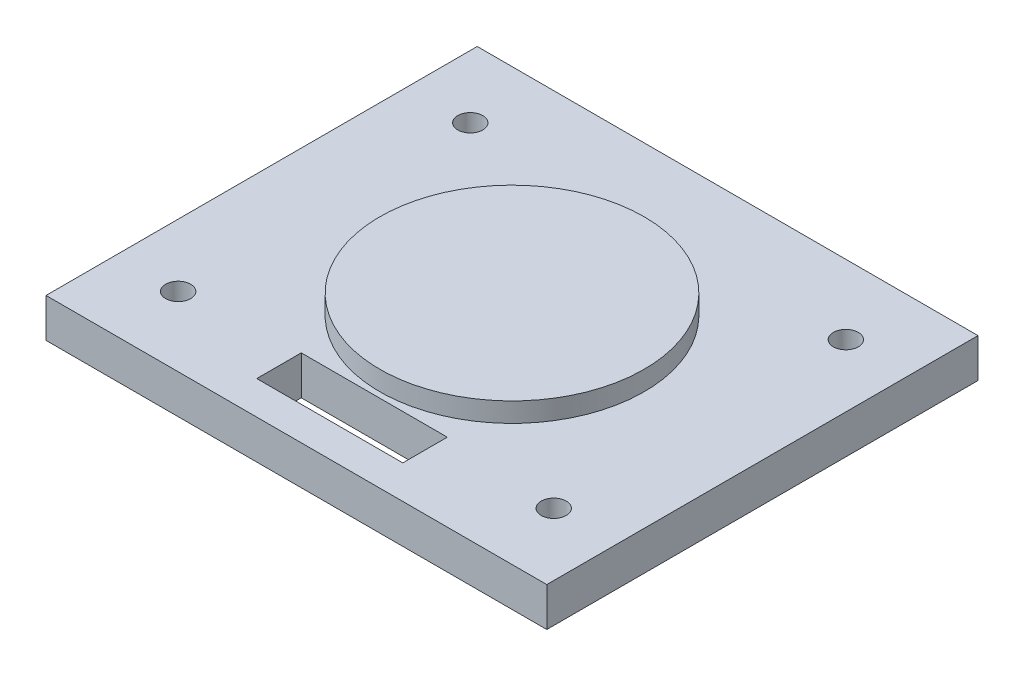
ISO-10303-21;
HEADER;
FILE_DESCRIPTION(('STEP AP214'),'2;1');
FILE_NAME('part.step','',(''),(''),'','','');
FILE_SCHEMA(('AUTOMOTIVE_DESIGN { 1 0 10303 214 1 1 1 1 }'));
ENDSEC;
DATA;
#1=APPLICATION_CONTEXT('core data for automotive mechanical design processes');
#2=APPLICATION_PROTOCOL_DEFINITION('international standard','automotive_design',2000,#1);
#3=PRODUCT_CONTEXT('',#1,'mechanical');
#4=PRODUCT('Part','Part','',(#3));
#5=PRODUCT_RELATED_PRODUCT_CATEGORY('part','',(#4));
#6=PRODUCT_DEFINITION_FORMATION('','',#4);
#7=PRODUCT_DEFINITION_CONTEXT('part definition',#1,'design');
#8=PRODUCT_DEFINITION('design','',#6,#7);
#9=PRODUCT_DEFINITION_SHAPE('','',#8);
#10=(LENGTH_UNIT() NAMED_UNIT(*) SI_UNIT(.MILLI.,.METRE.));
#11=(NAMED_UNIT(*) PLANE_ANGLE_UNIT() SI_UNIT($,.RADIAN.));
#12=(NAMED_UNIT(*) SI_UNIT($,.STERADIAN.) SOLID_ANGLE_UNIT());
#13=UNCERTAINTY_MEASURE_WITH_UNIT(LENGTH_MEASURE(1.E-05),#10,'distance_accuracy_value','');
#14=(GEOMETRIC_REPRESENTATION_CONTEXT(3) GLOBAL_UNCERTAINTY_ASSIGNED_CONTEXT((#13)) GLOBAL_UNIT_ASSIGNED_CONTEXT((#10,
#11,#12)) REPRESENTATION_CONTEXT('',''));
#15=CARTESIAN_POINT('',(0.,0.,0.));
#16=DIRECTION('',(0.,0.,1.));
#17=DIRECTION('',(1.,0.,0.));
#18=AXIS2_PLACEMENT_3D('',#15,#16,#17);
#19=CARTESIAN_POINT('',(0.,28.,0.));
#20=DIRECTION('',(0.,-1.,0.));
#21=DIRECTION('',(0.,0.,-1.));
#22=AXIS2_PLACEMENT_3D('',#19,#20,#21);
#23=PLANE('',#22);
#24=CARTESIAN_POINT('',(0.,28.,0.));
#25=DIRECTION('',(0.,-1.,0.));
#26=DIRECTION('',(0.,0.,-1.));
#27=AXIS2_PLACEMENT_3D('',#24,#25,#26);
#28=CIRCLE('',#27,95.);
#29=CARTESIAN_POINT('',(0.,28.,-95.));
#30=VERTEX_POINT('',#29);
#31=EDGE_CURVE('E11',#30,#30,#28,.F.);
#32=ORIENTED_EDGE('',*,*,#31,.F.);
#33=EDGE_LOOP('',(#32));
#34=FACE_BOUND('',#33,.T.);
#35=CARTESIAN_POINT('',(135.,28.,-105.));
#36=DIRECTION('',(0.,1.,0.));
#37=DIRECTION('',(0.,0.,1.));
#38=AXIS2_PLACEMENT_3D('',#35,#36,#37);
#39=CIRCLE('',#38,9.00000000000001);
#40=CARTESIAN_POINT('',(135.,28.,-96.));
#41=VERTEX_POINT('',#40);
#42=EDGE_CURVE('E142',#41,#41,#39,.T.);
#43=ORIENTED_EDGE('',*,*,#42,.F.);
#44=EDGE_LOOP('',(#43));
#45=FACE_BOUND('',#44,.T.);
#46=CARTESIAN_POINT('',(-135.,28.,-105.));
#47=DIRECTION('',(0.,1.,0.));
#48=DIRECTION('',(0.,0.,1.));
#49=AXIS2_PLACEMENT_3D('',#46,#47,#48);
#50=CIRCLE('',#49,9.00000000000001);
#51=CARTESIAN_POINT('',(-135.,28.,-96.));
#52=VERTEX_POINT('',#51);
#53=EDGE_CURVE('E148',#52,#52,#50,.T.);
#54=ORIENTED_EDGE('',*,*,#53,.F.);
#55=EDGE_LOOP('',(#54));
#56=FACE_BOUND('',#55,.T.);
#57=CARTESIAN_POINT('',(135.,28.,105.));
#58=DIRECTION('',(0.,1.,0.));
#59=DIRECTION('',(0.,0.,1.));
#60=AXIS2_PLACEMENT_3D('',#57,#58,#59);
#61=CIRCLE('',#60,9.00000000000001);
#62=CARTESIAN_POINT('',(135.,28.,114.));
#63=VERTEX_POINT('',#62);
#64=EDGE_CURVE('E154',#63,#63,#61,.T.);
#65=ORIENTED_EDGE('',*,*,#64,.F.);
#66=EDGE_LOOP('',(#65));
#67=FACE_BOUND('',#66,.T.);
#68=CARTESIAN_POINT('',(-135.,28.,105.));
#69=DIRECTION('',(0.,1.,0.));
#70=DIRECTION('',(0.,0.,1.));
#71=AXIS2_PLACEMENT_3D('',#68,#69,#70);
#72=CIRCLE('',#71,9.00000000000001);
#73=CARTESIAN_POINT('',(-135.,28.,114.));
#74=VERTEX_POINT('',#73);
#75=EDGE_CURVE('E160',#74,#74,#72,.T.);
#76=ORIENTED_EDGE('',*,*,#75,.F.);
#77=EDGE_LOOP('',(#76));
#78=FACE_BOUND('',#77,.T.);
#79=DIRECTION('',(0.,0.,-1.));
#80=VECTOR('',#79,1.);
#81=CARTESIAN_POINT('',(180.,28.,155.));
#82=LINE('',#81,#80);
#83=CARTESIAN_POINT('',(180.,28.,155.));
#84=VERTEX_POINT('',#83);
#85=CARTESIAN_POINT('',(180.,28.,-155.));
#86=VERTEX_POINT('',#85);
#87=EDGE_CURVE('E166',#84,#86,#82,.T.);
#88=ORIENTED_EDGE('',*,*,#87,.T.);
#89=DIRECTION('',(-1.,0.,0.));
#90=VECTOR('',#89,1.);
#91=CARTESIAN_POINT('',(-180.,28.,-155.));
#92=LINE('',#91,#90);
#93=CARTESIAN_POINT('',(-180.,28.,-155.));
#94=VERTEX_POINT('',#93);
#95=EDGE_CURVE('E169',#86,#94,#92,.T.);
#96=ORIENTED_EDGE('',*,*,#95,.T.);
#97=DIRECTION('',(0.,0.,1.));
#98=VECTOR('',#97,1.);
#99=CARTESIAN_POINT('',(-180.,28.,155.));
#100=LINE('',#99,#98);
#101=CARTESIAN_POINT('',(-180.,28.,155.));
#102=VERTEX_POINT('',#101);
#103=EDGE_CURVE('E172',#94,#102,#100,.T.);
#104=ORIENTED_EDGE('',*,*,#103,.T.);
#105=DIRECTION('',(1.,0.,0.));
#106=VECTOR('',#105,1.);
#107=CARTESIAN_POINT('',(-180.,28.,155.));
#108=LINE('',#107,#106);
#109=EDGE_CURVE('E174',#102,#84,#108,.T.);
#110=ORIENTED_EDGE('',*,*,#109,.T.);
#111=EDGE_LOOP('',(#88,#96,#104,#110));
#112=FACE_BOUND('',#111,.T.);
#113=DIRECTION('',(0.,0.,-1.));
#114=VECTOR('',#113,1.);
#115=CARTESIAN_POINT('',(52.5,28.,131.));
#116=LINE('',#115,#114);
#117=CARTESIAN_POINT('',(52.5,28.,131.));
#118=VERTEX_POINT('',#117);
#119=CARTESIAN_POINT('',(52.5,28.,99.));
#120=VERTEX_POINT('',#119);
#121=EDGE_CURVE('E105',#118,#120,#116,.T.);
#122=ORIENTED_EDGE('',*,*,#121,.F.);
#123=DIRECTION('',(1.,0.,0.));
#124=VECTOR('',#123,1.);
#125=CARTESIAN_POINT('',(-52.5,28.,131.));
#126=LINE('',#125,#124);
#127=CARTESIAN_POINT('',(-52.5,28.,131.));
#128=VERTEX_POINT('',#127);
#129=EDGE_CURVE('E127',#128,#118,#126,.T.);
#130=ORIENTED_EDGE('',*,*,#129,.F.);
#131=DIRECTION('',(0.,0.,1.));
#132=VECTOR('',#131,1.);
#133=CARTESIAN_POINT('',(-52.5,28.,131.));
#134=LINE('',#133,#132);
#135=CARTESIAN_POINT('',(-52.5,28.,99.));
#136=VERTEX_POINT('',#135);
#137=EDGE_CURVE('E125',#136,#128,#134,.T.);
#138=ORIENTED_EDGE('',*,*,#137,.F.);
#139=DIRECTION('',(-1.,0.,0.));
#140=VECTOR('',#139,1.);
#141=CARTESIAN_POINT('',(-52.5,28.,99.));
#142=LINE('',#141,#140);
#143=EDGE_CURVE('E113',#120,#136,#142,.T.);
#144=ORIENTED_EDGE('',*,*,#143,.F.);
#145=EDGE_LOOP('',(#122,#130,#138,#144));
#146=FACE_BOUND('',#145,.T.);
#147=ADVANCED_FACE('F39',(#34,#45,#56,#67,#78,#112,#146),#23,.F.);
#148=CARTESIAN_POINT('',(0.,0.,0.));
#149=DIRECTION('',(0.,-1.,0.));
#150=DIRECTION('',(0.,0.,-1.));
#151=AXIS2_PLACEMENT_3D('',#148,#149,#150);
#152=PLANE('',#151);
#153=CARTESIAN_POINT('',(-135.,0.,-105.));
#154=DIRECTION('',(0.,1.,0.));
#155=DIRECTION('',(0.,0.,1.));
#156=AXIS2_PLACEMENT_3D('',#153,#154,#155);
#157=CIRCLE('',#156,9.00000000000001);
#158=CARTESIAN_POINT('',(-135.,0.,-96.));
#159=VERTEX_POINT('',#158);
#160=EDGE_CURVE('E145',#159,#159,#157,.T.);
#161=ORIENTED_EDGE('',*,*,#160,.T.);
#162=EDGE_LOOP('',(#161));
#163=FACE_BOUND('',#162,.T.);
#164=CARTESIAN_POINT('',(-135.,0.,105.));
#165=DIRECTION('',(0.,1.,0.));
#166=DIRECTION('',(0.,0.,1.));
#167=AXIS2_PLACEMENT_3D('',#164,#165,#166);
#168=CIRCLE('',#167,9.00000000000001);
#169=CARTESIAN_POINT('',(-135.,0.,114.));
#170=VERTEX_POINT('',#169);
#171=EDGE_CURVE('E157',#170,#170,#168,.T.);
#172=ORIENTED_EDGE('',*,*,#171,.T.);
#173=EDGE_LOOP('',(#172));
#174=FACE_BOUND('',#173,.T.);
#175=DIRECTION('',(0.,0.,-1.));
#176=VECTOR('',#175,1.);
#177=CARTESIAN_POINT('',(180.,0.,155.));
#178=LINE('',#177,#176);
#179=CARTESIAN_POINT('',(180.,0.,155.));
#180=VERTEX_POINT('',#179);
#181=CARTESIAN_POINT('',(180.,0.,-155.));
#182=VERTEX_POINT('',#181);
#183=EDGE_CURVE('E163',#180,#182,#178,.T.);
#184=ORIENTED_EDGE('',*,*,#183,.F.);
#185=DIRECTION('',(1.,0.,0.));
#186=VECTOR('',#185,1.);
#187=CARTESIAN_POINT('',(-180.,0.,155.));
#188=LINE('',#187,#186);
#189=CARTESIAN_POINT('',(-180.,0.,155.));
#190=VERTEX_POINT('',#189);
#191=EDGE_CURVE('E170',#190,#180,#188,.T.);
#192=ORIENTED_EDGE('',*,*,#191,.F.);
#193=DIRECTION('',(0.,0.,1.));
#194=VECTOR('',#193,1.);
#195=CARTESIAN_POINT('',(-180.,0.,155.));
#196=LINE('',#195,#194);
#197=CARTESIAN_POINT('',(-180.,0.,-155.));
#198=VERTEX_POINT('',#197);
#199=EDGE_CURVE('E181',#198,#190,#196,.T.);
#200=ORIENTED_EDGE('',*,*,#199,.F.);
#201=DIRECTION('',(-1.,0.,0.));
#202=VECTOR('',#201,1.);
#203=CARTESIAN_POINT('',(-180.,0.,-155.));
#204=LINE('',#203,#202);
#205=EDGE_CURVE('E179',#182,#198,#204,.T.);
#206=ORIENTED_EDGE('',*,*,#205,.F.);
#207=EDGE_LOOP('',(#184,#192,#200,#206));
#208=FACE_BOUND('',#207,.T.);
#209=CARTESIAN_POINT('',(135.,0.,105.));
#210=DIRECTION('',(0.,1.,0.));
#211=DIRECTION('',(0.,0.,1.));
#212=AXIS2_PLACEMENT_3D('',#209,#210,#211);
#213=CIRCLE('',#212,9.00000000000001);
#214=CARTESIAN_POINT('',(135.,0.,114.));
#215=VERTEX_POINT('',#214);
#216=EDGE_CURVE('E151',#215,#215,#213,.T.);
#217=ORIENTED_EDGE('',*,*,#216,.T.);
#218=EDGE_LOOP('',(#217));
#219=FACE_BOUND('',#218,.T.);
#220=CARTESIAN_POINT('',(135.,0.,-105.));
#221=DIRECTION('',(0.,1.,0.));
#222=DIRECTION('',(0.,0.,1.));
#223=AXIS2_PLACEMENT_3D('',#220,#221,#222);
#224=CIRCLE('',#223,9.00000000000001);
#225=CARTESIAN_POINT('',(135.,0.,-96.));
#226=VERTEX_POINT('',#225);
#227=EDGE_CURVE('E121',#226,#226,#224,.T.);
#228=ORIENTED_EDGE('',*,*,#227,.T.);
#229=EDGE_LOOP('',(#228));
#230=FACE_BOUND('',#229,.T.);
#231=DIRECTION('',(1.,0.,0.));
#232=VECTOR('',#231,1.);
#233=CARTESIAN_POINT('',(-52.5,0.,131.));
#234=LINE('',#233,#232);
#235=CARTESIAN_POINT('',(-52.5,0.,131.));
#236=VERTEX_POINT('',#235);
#237=CARTESIAN_POINT('',(52.5,0.,131.));
#238=VERTEX_POINT('',#237);
#239=EDGE_CURVE('E114',#236,#238,#234,.T.);
#240=ORIENTED_EDGE('',*,*,#239,.T.);
#241=DIRECTION('',(0.,0.,-1.));
#242=VECTOR('',#241,1.);
#243=CARTESIAN_POINT('',(52.5,0.,131.));
#244=LINE('',#243,#242);
#245=CARTESIAN_POINT('',(52.5,0.,99.));
#246=VERTEX_POINT('',#245);
#247=EDGE_CURVE('E63',#238,#246,#244,.T.);
#248=ORIENTED_EDGE('',*,*,#247,.T.);
#249=DIRECTION('',(-1.,0.,0.));
#250=VECTOR('',#249,1.);
#251=CARTESIAN_POINT('',(-52.5,0.,99.));
#252=LINE('',#251,#250);
#253=CARTESIAN_POINT('',(-52.5,0.,99.));
#254=VERTEX_POINT('',#253);
#255=EDGE_CURVE('E120',#246,#254,#252,.T.);
#256=ORIENTED_EDGE('',*,*,#255,.T.);
#257=DIRECTION('',(0.,0.,1.));
#258=VECTOR('',#257,1.);
#259=CARTESIAN_POINT('',(-52.5,0.,131.));
#260=LINE('',#259,#258);
#261=EDGE_CURVE('E134',#254,#236,#260,.T.);
#262=ORIENTED_EDGE('',*,*,#261,.T.);
#263=EDGE_LOOP('',(#240,#248,#256,#262));
#264=FACE_BOUND('',#263,.T.);
#265=ADVANCED_FACE('F204',(#163,#174,#208,#219,#230,#264),#152,.T.);
#266=CARTESIAN_POINT('',(180.,28.,155.));
#267=DIRECTION('',(-1.,0.,0.));
#268=DIRECTION('',(0.,0.,1.));
#269=AXIS2_PLACEMENT_3D('',#266,#267,#268);
#270=PLANE('',#269);
#271=ORIENTED_EDGE('',*,*,#183,.T.);
#272=DIRECTION('',(0.,-1.,0.));
#273=VECTOR('',#272,1.);
#274=CARTESIAN_POINT('',(180.,28.,-155.));
#275=LINE('',#274,#273);
#276=EDGE_CURVE('E43',#86,#182,#275,.T.);
#277=ORIENTED_EDGE('',*,*,#276,.F.);
#278=ORIENTED_EDGE('',*,*,#87,.F.);
#279=DIRECTION('',(0.,-1.,0.));
#280=VECTOR('',#279,1.);
#281=CARTESIAN_POINT('',(180.,28.,155.));
#282=LINE('',#281,#280);
#283=EDGE_CURVE('E176',#84,#180,#282,.T.);
#284=ORIENTED_EDGE('',*,*,#283,.T.);
#285=EDGE_LOOP('',(#271,#277,#278,#284));
#286=FACE_BOUND('',#285,.T.);
#287=ADVANCED_FACE('F41',(#286),#270,.F.);
#288=CARTESIAN_POINT('',(-180.,28.,-155.));
#289=DIRECTION('',(0.,0.,1.));
#290=DIRECTION('',(1.,0.,0.));
#291=AXIS2_PLACEMENT_3D('',#288,#289,#290);
#292=PLANE('',#291);
#293=ORIENTED_EDGE('',*,*,#205,.T.);
#294=DIRECTION('',(0.,-1.,0.));
#295=VECTOR('',#294,1.);
#296=CARTESIAN_POINT('',(-180.,28.,-155.));
#297=LINE('',#296,#295);
#298=EDGE_CURVE('E188',#94,#198,#297,.T.);
#299=ORIENTED_EDGE('',*,*,#298,.F.);
#300=ORIENTED_EDGE('',*,*,#95,.F.);
#301=ORIENTED_EDGE('',*,*,#276,.T.);
#302=EDGE_LOOP('',(#293,#299,#300,#301));
#303=FACE_BOUND('',#302,.T.);
#304=ADVANCED_FACE('F197',(#303),#292,.F.);
#305=CARTESIAN_POINT('',(-180.,28.,155.));
#306=DIRECTION('',(1.,0.,0.));
#307=DIRECTION('',(0.,0.,-1.));
#308=AXIS2_PLACEMENT_3D('',#305,#306,#307);
#309=PLANE('',#308);
#310=ORIENTED_EDGE('',*,*,#199,.T.);
#311=DIRECTION('',(0.,-1.,0.));
#312=VECTOR('',#311,1.);
#313=CARTESIAN_POINT('',(-180.,28.,155.));
#314=LINE('',#313,#312);
#315=EDGE_CURVE('E186',#102,#190,#314,.T.);
#316=ORIENTED_EDGE('',*,*,#315,.F.);
#317=ORIENTED_EDGE('',*,*,#103,.F.);
#318=ORIENTED_EDGE('',*,*,#298,.T.);
#319=EDGE_LOOP('',(#310,#316,#317,#318));
#320=FACE_BOUND('',#319,.T.);
#321=ADVANCED_FACE('F207',(#320),#309,.F.);
#322=CARTESIAN_POINT('',(-180.,28.,155.));
#323=DIRECTION('',(0.,0.,-1.));
#324=DIRECTION('',(-1.,0.,0.));
#325=AXIS2_PLACEMENT_3D('',#322,#323,#324);
#326=PLANE('',#325);
#327=ORIENTED_EDGE('',*,*,#191,.T.);
#328=ORIENTED_EDGE('',*,*,#283,.F.);
#329=ORIENTED_EDGE('',*,*,#109,.F.);
#330=ORIENTED_EDGE('',*,*,#315,.T.);
#331=EDGE_LOOP('',(#327,#328,#329,#330));
#332=FACE_BOUND('',#331,.T.);
#333=ADVANCED_FACE('F210',(#332),#326,.F.);
#334=CARTESIAN_POINT('',(-135.,28.,105.));
#335=DIRECTION('',(0.,-1.,0.));
#336=DIRECTION('',(0.,0.,-1.));
#337=AXIS2_PLACEMENT_3D('',#334,#335,#336);
#338=CYLINDRICAL_SURFACE('',#337,9.00000000000001);
#339=ORIENTED_EDGE('',*,*,#75,.T.);
#340=EDGE_LOOP('',(#339));
#341=FACE_BOUND('',#340,.T.);
#342=ORIENTED_EDGE('',*,*,#171,.F.);
#343=EDGE_LOOP('',(#342));
#344=FACE_BOUND('',#343,.T.);
#345=ADVANCED_FACE('F223',(#341,#344),#338,.F.);
#346=CARTESIAN_POINT('',(135.,28.,105.));
#347=DIRECTION('',(0.,-1.,0.));
#348=DIRECTION('',(0.,0.,-1.));
#349=AXIS2_PLACEMENT_3D('',#346,#347,#348);
#350=CYLINDRICAL_SURFACE('',#349,9.00000000000001);
#351=ORIENTED_EDGE('',*,*,#64,.T.);
#352=EDGE_LOOP('',(#351));
#353=FACE_BOUND('',#352,.T.);
#354=ORIENTED_EDGE('',*,*,#216,.F.);
#355=EDGE_LOOP('',(#354));
#356=FACE_BOUND('',#355,.T.);
#357=ADVANCED_FACE('F321',(#353,#356),#350,.F.);
#358=CARTESIAN_POINT('',(-135.,28.,-105.));
#359=DIRECTION('',(0.,-1.,0.));
#360=DIRECTION('',(0.,0.,-1.));
#361=AXIS2_PLACEMENT_3D('',#358,#359,#360);
#362=CYLINDRICAL_SURFACE('',#361,9.00000000000001);
#363=ORIENTED_EDGE('',*,*,#53,.T.);
#364=EDGE_LOOP('',(#363));
#365=FACE_BOUND('',#364,.T.);
#366=ORIENTED_EDGE('',*,*,#160,.F.);
#367=EDGE_LOOP('',(#366));
#368=FACE_BOUND('',#367,.T.);
#369=ADVANCED_FACE('F311',(#365,#368),#362,.F.);
#370=CARTESIAN_POINT('',(135.,28.,-105.));
#371=DIRECTION('',(0.,-1.,0.));
#372=DIRECTION('',(0.,0.,-1.));
#373=AXIS2_PLACEMENT_3D('',#370,#371,#372);
#374=CYLINDRICAL_SURFACE('',#373,9.00000000000001);
#375=ORIENTED_EDGE('',*,*,#42,.T.);
#376=EDGE_LOOP('',(#375));
#377=FACE_BOUND('',#376,.T.);
#378=ORIENTED_EDGE('',*,*,#227,.F.);
#379=EDGE_LOOP('',(#378));
#380=FACE_BOUND('',#379,.T.);
#381=ADVANCED_FACE('F302',(#377,#380),#374,.F.);
#382=CARTESIAN_POINT('',(52.5,28.,131.));
#383=DIRECTION('',(-1.,0.,0.));
#384=DIRECTION('',(0.,0.,1.));
#385=AXIS2_PLACEMENT_3D('',#382,#383,#384);
#386=PLANE('',#385);
#387=ORIENTED_EDGE('',*,*,#247,.F.);
#388=DIRECTION('',(0.,-1.,0.));
#389=VECTOR('',#388,1.);
#390=CARTESIAN_POINT('',(52.5,28.,131.));
#391=LINE('',#390,#389);
#392=EDGE_CURVE('E109',#118,#238,#391,.T.);
#393=ORIENTED_EDGE('',*,*,#392,.F.);
#394=ORIENTED_EDGE('',*,*,#121,.T.);
#395=DIRECTION('',(0.,-1.,0.));
#396=VECTOR('',#395,1.);
#397=CARTESIAN_POINT('',(52.5,28.,99.));
#398=LINE('',#397,#396);
#399=EDGE_CURVE('E108',#120,#246,#398,.T.);
#400=ORIENTED_EDGE('',*,*,#399,.T.);
#401=EDGE_LOOP('',(#387,#393,#394,#400));
#402=FACE_BOUND('',#401,.T.);
#403=ADVANCED_FACE('F107',(#402),#386,.T.);
#404=CARTESIAN_POINT('',(-52.5,28.,99.));
#405=DIRECTION('',(0.,0.,1.));
#406=DIRECTION('',(1.,0.,0.));
#407=AXIS2_PLACEMENT_3D('',#404,#405,#406);
#408=PLANE('',#407);
#409=ORIENTED_EDGE('',*,*,#255,.F.);
#410=ORIENTED_EDGE('',*,*,#399,.F.);
#411=ORIENTED_EDGE('',*,*,#143,.T.);
#412=DIRECTION('',(0.,-1.,0.));
#413=VECTOR('',#412,1.);
#414=CARTESIAN_POINT('',(-52.5,28.,99.));
#415=LINE('',#414,#413);
#416=EDGE_CURVE('E122',#136,#254,#415,.T.);
#417=ORIENTED_EDGE('',*,*,#416,.T.);
#418=EDGE_LOOP('',(#409,#410,#411,#417));
#419=FACE_BOUND('',#418,.T.);
#420=ADVANCED_FACE('F117',(#419),#408,.T.);
#421=CARTESIAN_POINT('',(-52.5,28.,131.));
#422=DIRECTION('',(1.,0.,0.));
#423=DIRECTION('',(0.,0.,-1.));
#424=AXIS2_PLACEMENT_3D('',#421,#422,#423);
#425=PLANE('',#424);
#426=ORIENTED_EDGE('',*,*,#261,.F.);
#427=ORIENTED_EDGE('',*,*,#416,.F.);
#428=ORIENTED_EDGE('',*,*,#137,.T.);
#429=DIRECTION('',(0.,-1.,0.));
#430=VECTOR('',#429,1.);
#431=CARTESIAN_POINT('',(-52.5,28.,131.));
#432=LINE('',#431,#430);
#433=EDGE_CURVE('E55',#128,#236,#432,.T.);
#434=ORIENTED_EDGE('',*,*,#433,.T.);
#435=EDGE_LOOP('',(#426,#427,#428,#434));
#436=FACE_BOUND('',#435,.T.);
#437=ADVANCED_FACE('F277',(#436),#425,.T.);
#438=CARTESIAN_POINT('',(-52.5,28.,131.));
#439=DIRECTION('',(0.,0.,-1.));
#440=DIRECTION('',(-1.,0.,0.));
#441=AXIS2_PLACEMENT_3D('',#438,#439,#440);
#442=PLANE('',#441);
#443=ORIENTED_EDGE('',*,*,#239,.F.);
#444=ORIENTED_EDGE('',*,*,#433,.F.);
#445=ORIENTED_EDGE('',*,*,#129,.T.);
#446=ORIENTED_EDGE('',*,*,#392,.T.);
#447=EDGE_LOOP('',(#443,#444,#445,#446));
#448=FACE_BOUND('',#447,.T.);
#449=ADVANCED_FACE('F255',(#448),#442,.T.);
#450=CARTESIAN_POINT('',(0.,42.,0.));
#451=DIRECTION('',(0.,-1.,0.));
#452=DIRECTION('',(0.,0.,-1.));
#453=AXIS2_PLACEMENT_3D('',#450,#451,#452);
#454=CYLINDRICAL_SURFACE('',#453,95.);
#455=CARTESIAN_POINT('',(0.,42.,0.));
#456=DIRECTION('',(0.,1.,0.));
#457=DIRECTION('',(0.,0.,1.));
#458=AXIS2_PLACEMENT_3D('',#455,#456,#457);
#459=CIRCLE('',#458,95.);
#460=CARTESIAN_POINT('',(0.,42.,-95.));
#461=VERTEX_POINT('',#460);
#462=EDGE_CURVE('E132',#461,#461,#459,.T.);
#463=CARTESIAN_POINT('',(0.,42.,-95.));
#464=CARTESIAN_POINT('',(0.,41.8541666666667,-95.));
#465=CARTESIAN_POINT('',(0.,41.7083333333333,-95.));
#466=CARTESIAN_POINT('',(0.,41.4166666666667,-95.));
#467=CARTESIAN_POINT('',(0.,41.2708333333333,-95.));
#468=CARTESIAN_POINT('',(0.,40.9791666666667,-95.));
#469=CARTESIAN_POINT('',(0.,40.8333333333333,-95.));
#470=CARTESIAN_POINT('',(0.,40.5416666666667,-95.));
#471=CARTESIAN_POINT('',(0.,40.3958333333333,-95.));
#472=CARTESIAN_POINT('',(0.,40.1041666666667,-95.));
#473=CARTESIAN_POINT('',(0.,39.9583333333333,-95.));
#474=CARTESIAN_POINT('',(0.,39.6666666666667,-95.));
#475=CARTESIAN_POINT('',(0.,39.5208333333333,-95.));
#476=CARTESIAN_POINT('',(0.,39.2291666666667,-95.));
#477=CARTESIAN_POINT('',(0.,39.0833333333333,-95.));
#478=CARTESIAN_POINT('',(0.,38.7916666666667,-95.));
#479=CARTESIAN_POINT('',(0.,38.6458333333333,-95.));
#480=CARTESIAN_POINT('',(0.,38.3541666666667,-95.));
#481=CARTESIAN_POINT('',(0.,38.2083333333333,-95.));
#482=CARTESIAN_POINT('',(0.,37.9166666666667,-95.));
#483=CARTESIAN_POINT('',(0.,37.7708333333333,-95.));
#484=CARTESIAN_POINT('',(0.,37.4791666666667,-95.));
#485=CARTESIAN_POINT('',(0.,37.3333333333333,-95.));
#486=CARTESIAN_POINT('',(0.,37.0416666666667,-95.));
#487=CARTESIAN_POINT('',(0.,36.8958333333333,-95.));
#488=CARTESIAN_POINT('',(0.,36.6041666666667,-95.));
#489=CARTESIAN_POINT('',(0.,36.4583333333333,-95.));
#490=CARTESIAN_POINT('',(0.,36.1666666666667,-95.));
#491=CARTESIAN_POINT('',(0.,36.0208333333333,-95.));
#492=CARTESIAN_POINT('',(0.,35.7291666666667,-95.));
#493=CARTESIAN_POINT('',(0.,35.5833333333333,-95.));
#494=CARTESIAN_POINT('',(0.,35.2916666666667,-95.));
#495=CARTESIAN_POINT('',(0.,35.1458333333333,-95.));
#496=CARTESIAN_POINT('',(0.,34.8541666666667,-95.));
#497=CARTESIAN_POINT('',(0.,34.7083333333333,-95.));
#498=CARTESIAN_POINT('',(0.,34.4166666666667,-95.));
#499=CARTESIAN_POINT('',(0.,34.2708333333333,-95.));
#500=CARTESIAN_POINT('',(0.,33.9791666666667,-95.));
#501=CARTESIAN_POINT('',(0.,33.8333333333333,-95.));
#502=CARTESIAN_POINT('',(0.,33.5416666666667,-95.));
#503=CARTESIAN_POINT('',(0.,33.3958333333333,-95.));
#504=CARTESIAN_POINT('',(0.,33.1041666666667,-95.));
#505=CARTESIAN_POINT('',(0.,32.9583333333333,-95.));
#506=CARTESIAN_POINT('',(0.,32.6666666666667,-95.));
#507=CARTESIAN_POINT('',(0.,32.5208333333333,-95.));
#508=CARTESIAN_POINT('',(0.,32.2291666666667,-95.));
#509=CARTESIAN_POINT('',(0.,32.0833333333333,-95.));
#510=CARTESIAN_POINT('',(0.,31.7916666666667,-95.));
#511=CARTESIAN_POINT('',(0.,31.6458333333333,-95.));
#512=CARTESIAN_POINT('',(0.,31.3541666666667,-95.));
#513=CARTESIAN_POINT('',(0.,31.2083333333333,-95.));
#514=CARTESIAN_POINT('',(0.,30.9166666666667,-95.));
#515=CARTESIAN_POINT('',(0.,30.7708333333333,-95.));
#516=CARTESIAN_POINT('',(0.,30.4791666666667,-95.));
#517=CARTESIAN_POINT('',(0.,30.3333333333333,-95.));
#518=CARTESIAN_POINT('',(0.,30.0416666666667,-95.));
#519=CARTESIAN_POINT('',(0.,29.8958333333333,-95.));
#520=CARTESIAN_POINT('',(0.,29.6041666666667,-95.));
#521=CARTESIAN_POINT('',(0.,29.4583333333333,-95.));
#522=CARTESIAN_POINT('',(0.,29.1666666666667,-95.));
#523=CARTESIAN_POINT('',(0.,29.0208333333333,-95.));
#524=CARTESIAN_POINT('',(0.,28.7291666666667,-95.));
#525=CARTESIAN_POINT('',(0.,28.5833333333333,-95.));
#526=CARTESIAN_POINT('',(0.,28.2916666666667,-95.));
#527=CARTESIAN_POINT('',(0.,28.1458333333333,-95.));
#528=CARTESIAN_POINT('',(0.,28.,-95.));
#529=B_SPLINE_CURVE_WITH_KNOTS('',3,(#463,#464,#465,#466,#467,#468,#469,#470,#471,#472,#473,
#474,#475,#476,#477,#478,#479,#480,#481,#482,#483,#484,#485,#486,#487,#488,#489,#490,#491,#492,
#493,#494,#495,#496,#497,#498,#499,#500,#501,#502,#503,#504,#505,#506,#507,#508,#509,#510,#511,
#512,#513,#514,#515,#516,#517,#518,#519,#520,#521,#522,#523,#524,#525,#526,#527,#528),
.UNSPECIFIED.,.F.,.F.,(4,2,2,2,2,2,2,2,2,2,2,2,2,2,2,2,2,2,2,2,2,2,2,2,2,2,2,2,2,2,2,2,4),(0.,
0.4375,0.875000000000001,1.3125,1.75,2.1875,2.625,3.0625,3.5,3.9375,4.375,4.8125,5.25,
5.68750000000001,6.125,6.5625,7.,7.4375,7.875,8.3125,8.75,9.1875,9.625,10.0625,10.5,10.9375,
11.375,11.8125,12.25,12.6875,13.125,13.5625,14.),.UNSPECIFIED.);
#530=EDGE_CURVE('BSEAM250',#461,#30,#529,.T.);
#531=ORIENTED_EDGE('',*,*,#462,.F.);
#532=ORIENTED_EDGE('',*,*,#31,.T.);
#533=ORIENTED_EDGE('',*,*,#530,.T.);
#534=ORIENTED_EDGE('',*,*,#530,.F.);
#535=EDGE_LOOP('',(#531,#533,#532,#534));
#536=FACE_BOUND('',#535,.T.);
#537=ADVANCED_FACE('F250',(#536),#454,.T.);
#538=CARTESIAN_POINT('',(0.,42.,0.));
#539=DIRECTION('',(0.,1.,0.));
#540=DIRECTION('',(0.,0.,1.));
#541=AXIS2_PLACEMENT_3D('',#538,#539,#540);
#542=PLANE('',#541);
#543=ORIENTED_EDGE('',*,*,#462,.T.);
#544=EDGE_LOOP('',(#543));
#545=FACE_BOUND('',#544,.T.);
#546=ADVANCED_FACE('F254',(#545),#542,.T.);
#547=CLOSED_SHELL('',(#147,#265,#287,#304,#321,#333,#345,#357,#369,#381,#403,#420,#437,#449,
#537,#546));
#548=MANIFOLD_SOLID_BREP('B2',#547);
#549=ADVANCED_BREP_SHAPE_REPRESENTATION('',(#18,#548),#14);
#550=SHAPE_DEFINITION_REPRESENTATION(#9,#549);
ENDSEC;
END-ISO-10303-21;
